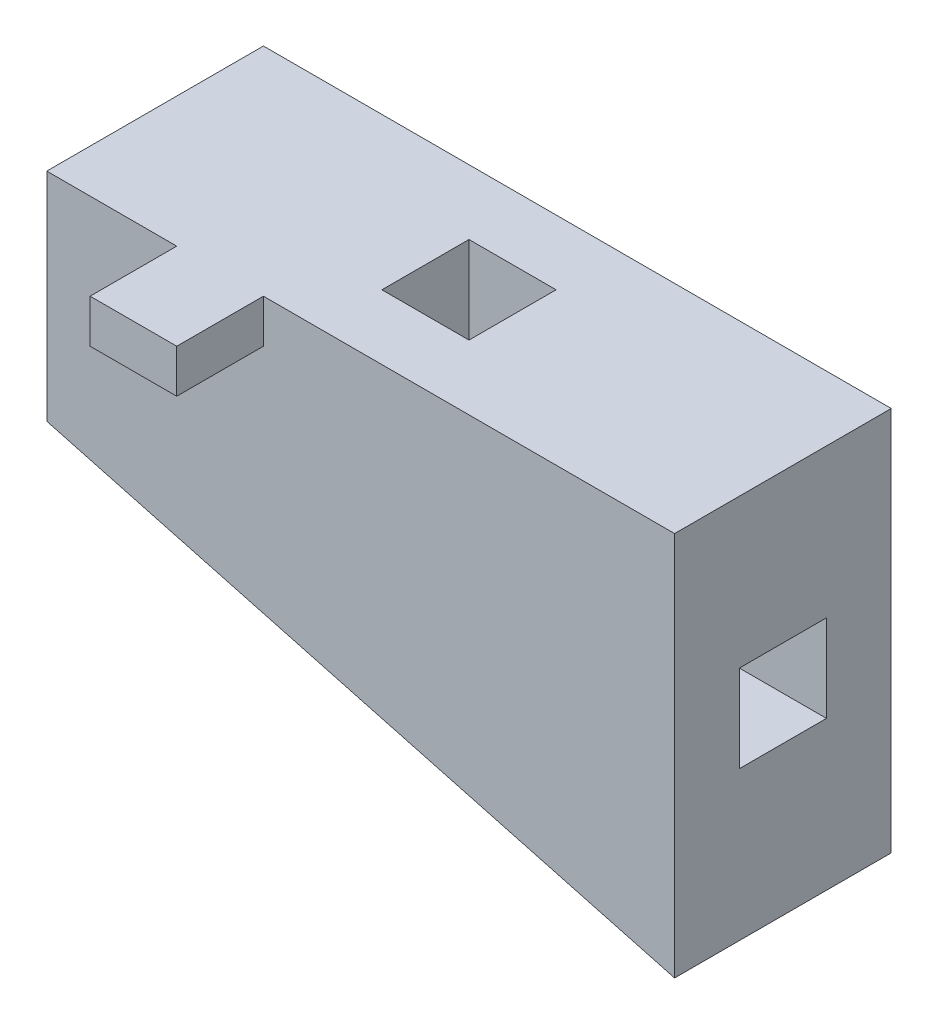
ISO-10303-21;
HEADER;
FILE_DESCRIPTION(('STEP AP214'),'2;1');
FILE_NAME('part.step','',(''),(''),'','','');
FILE_SCHEMA(('AUTOMOTIVE_DESIGN { 1 0 10303 214 1 1 1 1 }'));
ENDSEC;
DATA;
#1=APPLICATION_CONTEXT('core data for automotive mechanical design processes');
#2=APPLICATION_PROTOCOL_DEFINITION('international standard','automotive_design',2000,#1);
#3=PRODUCT_CONTEXT('',#1,'mechanical');
#4=PRODUCT('Part','Part','',(#3));
#5=PRODUCT_RELATED_PRODUCT_CATEGORY('part','',(#4));
#6=PRODUCT_DEFINITION_FORMATION('','',#4);
#7=PRODUCT_DEFINITION_CONTEXT('part definition',#1,'design');
#8=PRODUCT_DEFINITION('design','',#6,#7);
#9=PRODUCT_DEFINITION_SHAPE('','',#8);
#10=(LENGTH_UNIT() NAMED_UNIT(*) SI_UNIT(.MILLI.,.METRE.));
#11=(NAMED_UNIT(*) PLANE_ANGLE_UNIT() SI_UNIT($,.RADIAN.));
#12=(NAMED_UNIT(*) SI_UNIT($,.STERADIAN.) SOLID_ANGLE_UNIT());
#13=UNCERTAINTY_MEASURE_WITH_UNIT(LENGTH_MEASURE(1.E-05),#10,'distance_accuracy_value','');
#14=(GEOMETRIC_REPRESENTATION_CONTEXT(3) GLOBAL_UNCERTAINTY_ASSIGNED_CONTEXT((#13)) GLOBAL_UNIT_ASSIGNED_CONTEXT((#10,
#11,#12)) REPRESENTATION_CONTEXT('',''));
#15=CARTESIAN_POINT('',(0.,0.,0.));
#16=DIRECTION('',(0.,0.,1.));
#17=DIRECTION('',(1.,0.,0.));
#18=AXIS2_PLACEMENT_3D('',#15,#16,#17);
#19=CARTESIAN_POINT('',(45.6887702745492,31.6424845178765,50.));
#20=DIRECTION('',(0.,0.,1.));
#21=DIRECTION('',(1.,0.,0.));
#22=AXIS2_PLACEMENT_3D('',#19,#20,#21);
#23=PLANE('',#22);
#24=DIRECTION('',(1.,0.,0.));
#25=VECTOR('',#24,1.);
#26=CARTESIAN_POINT('',(45.6887702745492,-18.2414554532318,50.));
#27=LINE('',#26,#25);
#28=CARTESIAN_POINT('',(15.6887702745492,-18.2414554532318,50.));
#29=VERTEX_POINT('',#28);
#30=CARTESIAN_POINT('',(110.57764421791,-18.2414554532318,50.));
#31=VERTEX_POINT('',#30);
#32=EDGE_CURVE('E269',#29,#31,#27,.T.);
#33=ORIENTED_EDGE('',*,*,#32,.F.);
#34=DIRECTION('',(0.,-1.,0.));
#35=VECTOR('',#34,1.);
#36=CARTESIAN_POINT('',(15.6887702745492,0.,50.));
#37=LINE('',#36,#35);
#38=CARTESIAN_POINT('',(15.6887702745492,-28.2414554532318,50.));
#39=VERTEX_POINT('',#38);
#40=EDGE_CURVE('E65',#29,#39,#37,.T.);
#41=ORIENTED_EDGE('',*,*,#40,.T.);
#42=DIRECTION('',(1.,0.,0.));
#43=VECTOR('',#42,1.);
#44=CARTESIAN_POINT('',(0.,-28.2414554532318,50.));
#45=LINE('',#44,#43);
#46=CARTESIAN_POINT('',(-4.3112297254508,-28.2414554532318,50.));
#47=VERTEX_POINT('',#46);
#48=EDGE_CURVE('E197',#47,#39,#45,.T.);
#49=ORIENTED_EDGE('',*,*,#48,.F.);
#50=DIRECTION('',(0.,-1.,0.));
#51=VECTOR('',#50,1.);
#52=CARTESIAN_POINT('',(-4.31122972545079,0.,50.));
#53=LINE('',#52,#51);
#54=CARTESIAN_POINT('',(-4.3112297254508,-18.2414554532318,50.));
#55=VERTEX_POINT('',#54);
#56=EDGE_CURVE('E205',#55,#47,#53,.T.);
#57=ORIENTED_EDGE('',*,*,#56,.F.);
#58=CARTESIAN_POINT('',(-34.3112297254508,-18.2414554532318,50.));
#59=VERTEX_POINT('',#58);
#60=EDGE_CURVE('E270',#59,#55,#27,.T.);
#61=ORIENTED_EDGE('',*,*,#60,.F.);
#62=DIRECTION('',(0.,1.,0.));
#63=VECTOR('',#62,1.);
#64=CARTESIAN_POINT('',(-34.3112297254508,-68.2414554532319,50.));
#65=LINE('',#64,#63);
#66=CARTESIAN_POINT('',(-34.3112297254508,-68.2414554532319,50.));
#67=VERTEX_POINT('',#66);
#68=EDGE_CURVE('E245',#67,#59,#65,.T.);
#69=ORIENTED_EDGE('',*,*,#68,.F.);
#70=DIRECTION('',(-0.96592582628907,0.258819045102514,0.));
#71=VECTOR('',#70,1.);
#72=CARTESIAN_POINT('',(-34.3112297254508,-68.2414554532319,50.));
#73=LINE('',#72,#71);
#74=CARTESIAN_POINT('',(110.57764421791,-107.064312218609,50.));
#75=VERTEX_POINT('',#74);
#76=EDGE_CURVE('E260',#75,#67,#73,.T.);
#77=ORIENTED_EDGE('',*,*,#76,.F.);
#78=DIRECTION('',(0.,-1.,0.));
#79=VECTOR('',#78,1.);
#80=CARTESIAN_POINT('',(110.57764421791,31.6424845178765,50.));
#81=LINE('',#80,#79);
#82=EDGE_CURVE('E49',#31,#75,#81,.T.);
#83=ORIENTED_EDGE('',*,*,#82,.F.);
#84=EDGE_LOOP('',(#33,#41,#49,#57,#61,#69,#77,#83));
#85=FACE_BOUND('',#84,.T.);
#86=ADVANCED_FACE('F40',(#85),#23,.T.);
#87=CARTESIAN_POINT('',(110.57764421791,0.,0.));
#88=DIRECTION('',(-1.,0.,0.));
#89=DIRECTION('',(0.,-1.,0.));
#90=AXIS2_PLACEMENT_3D('',#87,#88,#89);
#91=PLANE('',#90);
#92=DIRECTION('',(0.,-1.,0.));
#93=VECTOR('',#92,1.);
#94=CARTESIAN_POINT('',(110.57764421791,-52.6028838359204,35.0500000000001));
#95=LINE('',#94,#93);
#96=CARTESIAN_POINT('',(110.57764421791,-52.6028838359204,35.0500000000001));
#97=VERTEX_POINT('',#96);
#98=CARTESIAN_POINT('',(110.57764421791,-72.7028838359204,35.0500000000001));
#99=VERTEX_POINT('',#98);
#100=EDGE_CURVE('E184',#97,#99,#95,.T.);
#101=ORIENTED_EDGE('',*,*,#100,.F.);
#102=DIRECTION('',(0.,0.,1.));
#103=VECTOR('',#102,1.);
#104=CARTESIAN_POINT('',(110.57764421791,-52.6028838359204,14.95));
#105=LINE('',#104,#103);
#106=CARTESIAN_POINT('',(110.57764421791,-52.6028838359204,14.95));
#107=VERTEX_POINT('',#106);
#108=EDGE_CURVE('E57',#107,#97,#105,.T.);
#109=ORIENTED_EDGE('',*,*,#108,.F.);
#110=DIRECTION('',(0.,1.,0.));
#111=VECTOR('',#110,1.);
#112=CARTESIAN_POINT('',(110.57764421791,-72.7028838359204,14.95));
#113=LINE('',#112,#111);
#114=CARTESIAN_POINT('',(110.57764421791,-72.7028838359204,14.95));
#115=VERTEX_POINT('',#114);
#116=EDGE_CURVE('E175',#115,#107,#113,.T.);
#117=ORIENTED_EDGE('',*,*,#116,.F.);
#118=DIRECTION('',(0.,0.,-1.));
#119=VECTOR('',#118,1.);
#120=CARTESIAN_POINT('',(110.57764421791,-72.7028838359204,35.0500000000001));
#121=LINE('',#120,#119);
#122=EDGE_CURVE('E178',#99,#115,#121,.T.);
#123=ORIENTED_EDGE('',*,*,#122,.F.);
#124=EDGE_LOOP('',(#101,#109,#117,#123));
#125=FACE_BOUND('',#124,.T.);
#126=ORIENTED_EDGE('',*,*,#82,.T.);
#127=DIRECTION('',(0.,0.,-1.));
#128=VECTOR('',#127,1.);
#129=CARTESIAN_POINT('',(110.57764421791,-107.064312218609,50.));
#130=LINE('',#129,#128);
#131=CARTESIAN_POINT('',(110.57764421791,-107.064312218609,0.));
#132=VERTEX_POINT('',#131);
#133=EDGE_CURVE('E11',#75,#132,#130,.T.);
#134=ORIENTED_EDGE('',*,*,#133,.T.);
#135=DIRECTION('',(0.,-1.,0.));
#136=VECTOR('',#135,1.);
#137=CARTESIAN_POINT('',(110.57764421791,31.7585445467682,0.));
#138=LINE('',#137,#136);
#139=CARTESIAN_POINT('',(110.57764421791,-18.2414554532318,0.));
#140=VERTEX_POINT('',#139);
#141=EDGE_CURVE('E273',#140,#132,#138,.T.);
#142=ORIENTED_EDGE('',*,*,#141,.F.);
#143=DIRECTION('',(0.,0.,-1.));
#144=VECTOR('',#143,1.);
#145=CARTESIAN_POINT('',(110.57764421791,-18.2414554532318,0.));
#146=LINE('',#145,#144);
#147=EDGE_CURVE('E44',#31,#140,#146,.T.);
#148=ORIENTED_EDGE('',*,*,#147,.F.);
#149=EDGE_LOOP('',(#126,#134,#142,#148));
#150=FACE_BOUND('',#149,.T.);
#151=ADVANCED_FACE('F42',(#125,#150),#91,.F.);
#152=CARTESIAN_POINT('',(0.,-18.2414554532318,0.));
#153=DIRECTION('',(0.,-1.,0.));
#154=DIRECTION('',(1.,0.,0.));
#155=AXIS2_PLACEMENT_3D('',#152,#153,#154);
#156=PLANE('',#155);
#157=ORIENTED_EDGE('',*,*,#60,.T.);
#158=DIRECTION('',(0.,0.,-1.));
#159=VECTOR('',#158,1.);
#160=CARTESIAN_POINT('',(-4.31122972545079,-18.2414554532318,70.));
#161=LINE('',#160,#159);
#162=CARTESIAN_POINT('',(-4.31122972545079,-18.2414554532318,70.));
#163=VERTEX_POINT('',#162);
#164=EDGE_CURVE('E214',#163,#55,#161,.T.);
#165=ORIENTED_EDGE('',*,*,#164,.F.);
#166=DIRECTION('',(-1.,0.,0.));
#167=VECTOR('',#166,1.);
#168=CARTESIAN_POINT('',(0.,-18.2414554532318,70.));
#169=LINE('',#168,#167);
#170=CARTESIAN_POINT('',(15.6887702745492,-18.2414554532318,70.));
#171=VERTEX_POINT('',#170);
#172=EDGE_CURVE('E196',#171,#163,#169,.T.);
#173=ORIENTED_EDGE('',*,*,#172,.F.);
#174=DIRECTION('',(0.,0.,-1.));
#175=VECTOR('',#174,1.);
#176=CARTESIAN_POINT('',(15.6887702745492,-18.2414554532318,70.));
#177=LINE('',#176,#175);
#178=EDGE_CURVE('E217',#171,#29,#177,.T.);
#179=ORIENTED_EDGE('',*,*,#178,.T.);
#180=ORIENTED_EDGE('',*,*,#32,.T.);
#181=ORIENTED_EDGE('',*,*,#147,.T.);
#182=DIRECTION('',(1.,0.,0.));
#183=VECTOR('',#182,1.);
#184=CARTESIAN_POINT('',(-34.3112297254508,-18.2414554532318,0.));
#185=LINE('',#184,#183);
#186=CARTESIAN_POINT('',(-34.3112297254508,-18.2414554532318,0.));
#187=VERTEX_POINT('',#186);
#188=EDGE_CURVE('E263',#187,#140,#185,.T.);
#189=ORIENTED_EDGE('',*,*,#188,.F.);
#190=DIRECTION('',(0.,0.,-1.));
#191=VECTOR('',#190,1.);
#192=CARTESIAN_POINT('',(-34.3112297254508,-18.2414554532318,750.));
#193=LINE('',#192,#191);
#194=EDGE_CURVE('E267',#59,#187,#193,.T.);
#195=ORIENTED_EDGE('',*,*,#194,.F.);
#196=EDGE_LOOP('',(#157,#165,#173,#179,#180,#181,#189,#195));
#197=FACE_BOUND('',#196,.T.);
#198=DIRECTION('',(0.,0.,-1.));
#199=VECTOR('',#198,1.);
#200=CARTESIAN_POINT('',(28.0832072462295,-18.2414554532318,0.));
#201=LINE('',#200,#199);
#202=CARTESIAN_POINT('',(28.0832072462295,-18.2414554532318,35.05));
#203=VERTEX_POINT('',#202);
#204=CARTESIAN_POINT('',(28.0832072462295,-18.2414554532318,14.95));
#205=VERTEX_POINT('',#204);
#206=EDGE_CURVE('E220',#203,#205,#201,.T.);
#207=ORIENTED_EDGE('',*,*,#206,.T.);
#208=DIRECTION('',(1.,0.,0.));
#209=VECTOR('',#208,1.);
#210=CARTESIAN_POINT('',(0.,-18.2414554532318,14.95));
#211=LINE('',#210,#209);
#212=CARTESIAN_POINT('',(48.1832072462295,-18.2414554532318,14.95));
#213=VERTEX_POINT('',#212);
#214=EDGE_CURVE('E225',#205,#213,#211,.T.);
#215=ORIENTED_EDGE('',*,*,#214,.T.);
#216=DIRECTION('',(0.,0.,1.));
#217=VECTOR('',#216,1.);
#218=CARTESIAN_POINT('',(48.1832072462295,-18.2414554532318,0.));
#219=LINE('',#218,#217);
#220=CARTESIAN_POINT('',(48.1832072462295,-18.2414554532318,35.05));
#221=VERTEX_POINT('',#220);
#222=EDGE_CURVE('E238',#213,#221,#219,.T.);
#223=ORIENTED_EDGE('',*,*,#222,.T.);
#224=DIRECTION('',(1.,0.,0.));
#225=VECTOR('',#224,1.);
#226=CARTESIAN_POINT('',(0.,-18.2414554532318,35.05));
#227=LINE('',#226,#225);
#228=EDGE_CURVE('E235',#203,#221,#227,.T.);
#229=ORIENTED_EDGE('',*,*,#228,.F.);
#230=EDGE_LOOP('',(#207,#215,#223,#229));
#231=FACE_BOUND('',#230,.T.);
#232=ADVANCED_FACE('F282',(#197,#231),#156,.F.);
#233=CARTESIAN_POINT('',(-34.3112297254508,-68.3575154821235,750.));
#234=DIRECTION('',(1.,0.,0.));
#235=DIRECTION('',(0.,1.,0.));
#236=AXIS2_PLACEMENT_3D('',#233,#234,#235);
#237=PLANE('',#236);
#238=ORIENTED_EDGE('',*,*,#68,.T.);
#239=ORIENTED_EDGE('',*,*,#194,.T.);
#240=DIRECTION('',(0.,-1.,0.));
#241=VECTOR('',#240,1.);
#242=CARTESIAN_POINT('',(-34.3112297254508,31.7585445467682,0.));
#243=LINE('',#242,#241);
#244=CARTESIAN_POINT('',(-34.3112297254508,-68.2414554532319,0.));
#245=VERTEX_POINT('',#244);
#246=EDGE_CURVE('E257',#187,#245,#243,.T.);
#247=ORIENTED_EDGE('',*,*,#246,.T.);
#248=DIRECTION('',(0.,0.,1.));
#249=VECTOR('',#248,1.);
#250=CARTESIAN_POINT('',(-34.3112297254508,-68.2414554532319,0.));
#251=LINE('',#250,#249);
#252=EDGE_CURVE('E254',#245,#67,#251,.T.);
#253=ORIENTED_EDGE('',*,*,#252,.T.);
#254=EDGE_LOOP('',(#238,#239,#247,#253));
#255=FACE_BOUND('',#254,.T.);
#256=ADVANCED_FACE('F290',(#255),#237,.F.);
#257=CARTESIAN_POINT('',(-34.3112297254508,-68.2414554532319,50.));
#258=DIRECTION('',(-0.258819045102514,-0.96592582628907,0.));
#259=DIRECTION('',(0.96592582628907,-0.258819045102514,0.));
#260=AXIS2_PLACEMENT_3D('',#257,#258,#259);
#261=PLANE('',#260);
#262=ORIENTED_EDGE('',*,*,#133,.F.);
#263=ORIENTED_EDGE('',*,*,#76,.T.);
#264=ORIENTED_EDGE('',*,*,#252,.F.);
#265=DIRECTION('',(-0.96592582628907,0.258819045102514,0.));
#266=VECTOR('',#265,1.);
#267=CARTESIAN_POINT('',(-34.3112297254508,-68.2414554532319,0.));
#268=LINE('',#267,#266);
#269=EDGE_CURVE('E261',#132,#245,#268,.T.);
#270=ORIENTED_EDGE('',*,*,#269,.F.);
#271=EDGE_LOOP('',(#262,#263,#264,#270));
#272=FACE_BOUND('',#271,.T.);
#273=ADVANCED_FACE('F292',(#272),#261,.T.);
#274=CARTESIAN_POINT('',(-34.3112297254508,31.7585445467682,0.));
#275=DIRECTION('',(0.,0.,1.));
#276=DIRECTION('',(1.,0.,0.));
#277=AXIS2_PLACEMENT_3D('',#274,#275,#276);
#278=PLANE('',#277);
#279=ORIENTED_EDGE('',*,*,#188,.T.);
#280=ORIENTED_EDGE('',*,*,#141,.T.);
#281=ORIENTED_EDGE('',*,*,#269,.T.);
#282=ORIENTED_EDGE('',*,*,#246,.F.);
#283=EDGE_LOOP('',(#279,#280,#281,#282));
#284=FACE_BOUND('',#283,.T.);
#285=ADVANCED_FACE('F287',(#284),#278,.F.);
#286=CARTESIAN_POINT('',(0.,-38.2414554532318,14.95));
#287=DIRECTION('',(0.,0.,1.));
#288=DIRECTION('',(1.,0.,0.));
#289=AXIS2_PLACEMENT_3D('',#286,#287,#288);
#290=PLANE('',#289);
#291=ORIENTED_EDGE('',*,*,#214,.F.);
#292=DIRECTION('',(0.,1.,0.));
#293=VECTOR('',#292,1.);
#294=CARTESIAN_POINT('',(28.0832072462295,-38.2414554532318,14.95));
#295=LINE('',#294,#293);
#296=CARTESIAN_POINT('',(28.0832072462295,-38.2414554532318,14.95));
#297=VERTEX_POINT('',#296);
#298=EDGE_CURVE('E232',#297,#205,#295,.T.);
#299=ORIENTED_EDGE('',*,*,#298,.F.);
#300=DIRECTION('',(1.,0.,0.));
#301=VECTOR('',#300,1.);
#302=CARTESIAN_POINT('',(0.,-38.2414554532318,14.95));
#303=LINE('',#302,#301);
#304=CARTESIAN_POINT('',(48.1832072462295,-38.2414554532318,14.95));
#305=VERTEX_POINT('',#304);
#306=EDGE_CURVE('E230',#297,#305,#303,.T.);
#307=ORIENTED_EDGE('',*,*,#306,.T.);
#308=DIRECTION('',(0.,1.,0.));
#309=VECTOR('',#308,1.);
#310=CARTESIAN_POINT('',(48.1832072462295,-38.2414554532318,14.95));
#311=LINE('',#310,#309);
#312=EDGE_CURVE('E243',#305,#213,#311,.T.);
#313=ORIENTED_EDGE('',*,*,#312,.T.);
#314=EDGE_LOOP('',(#291,#299,#307,#313));
#315=FACE_BOUND('',#314,.T.);
#316=ADVANCED_FACE('F328',(#315),#290,.T.);
#317=CARTESIAN_POINT('',(48.1832072462295,-38.2414554532318,0.));
#318=DIRECTION('',(-1.,0.,0.));
#319=DIRECTION('',(0.,0.,1.));
#320=AXIS2_PLACEMENT_3D('',#317,#318,#319);
#321=PLANE('',#320);
#322=ORIENTED_EDGE('',*,*,#222,.F.);
#323=ORIENTED_EDGE('',*,*,#312,.F.);
#324=DIRECTION('',(0.,0.,1.));
#325=VECTOR('',#324,1.);
#326=CARTESIAN_POINT('',(48.1832072462295,-38.2414554532318,0.));
#327=LINE('',#326,#325);
#328=CARTESIAN_POINT('',(48.1832072462295,-38.2414554532318,35.05));
#329=VERTEX_POINT('',#328);
#330=EDGE_CURVE('E228',#305,#329,#327,.T.);
#331=ORIENTED_EDGE('',*,*,#330,.T.);
#332=DIRECTION('',(0.,1.,0.));
#333=VECTOR('',#332,1.);
#334=CARTESIAN_POINT('',(48.1832072462295,-38.2414554532318,35.05));
#335=LINE('',#334,#333);
#336=EDGE_CURVE('E246',#329,#221,#335,.T.);
#337=ORIENTED_EDGE('',*,*,#336,.T.);
#338=EDGE_LOOP('',(#322,#323,#331,#337));
#339=FACE_BOUND('',#338,.T.);
#340=ADVANCED_FACE('F337',(#339),#321,.T.);
#341=CARTESIAN_POINT('',(0.,-38.2414554532318,35.05));
#342=DIRECTION('',(0.,0.,1.));
#343=DIRECTION('',(1.,0.,0.));
#344=AXIS2_PLACEMENT_3D('',#341,#342,#343);
#345=PLANE('',#344);
#346=ORIENTED_EDGE('',*,*,#228,.T.);
#347=ORIENTED_EDGE('',*,*,#336,.F.);
#348=DIRECTION('',(1.,0.,0.));
#349=VECTOR('',#348,1.);
#350=CARTESIAN_POINT('',(0.,-38.2414554532318,35.05));
#351=LINE('',#350,#349);
#352=CARTESIAN_POINT('',(28.0832072462295,-38.2414554532318,35.05));
#353=VERTEX_POINT('',#352);
#354=EDGE_CURVE('E224',#353,#329,#351,.T.);
#355=ORIENTED_EDGE('',*,*,#354,.F.);
#356=DIRECTION('',(0.,1.,0.));
#357=VECTOR('',#356,1.);
#358=CARTESIAN_POINT('',(28.0832072462295,-38.2414554532318,35.05));
#359=LINE('',#358,#357);
#360=EDGE_CURVE('E248',#353,#203,#359,.T.);
#361=ORIENTED_EDGE('',*,*,#360,.T.);
#362=EDGE_LOOP('',(#346,#347,#355,#361));
#363=FACE_BOUND('',#362,.T.);
#364=ADVANCED_FACE('F345',(#363),#345,.F.);
#365=CARTESIAN_POINT('',(28.0832072462295,-38.2414554532318,0.));
#366=DIRECTION('',(1.,0.,0.));
#367=DIRECTION('',(0.,1.,0.));
#368=AXIS2_PLACEMENT_3D('',#365,#366,#367);
#369=PLANE('',#368);
#370=ORIENTED_EDGE('',*,*,#206,.F.);
#371=ORIENTED_EDGE('',*,*,#360,.F.);
#372=DIRECTION('',(0.,0.,-1.));
#373=VECTOR('',#372,1.);
#374=CARTESIAN_POINT('',(28.0832072462295,-38.2414554532318,0.));
#375=LINE('',#374,#373);
#376=EDGE_CURVE('E221',#353,#297,#375,.T.);
#377=ORIENTED_EDGE('',*,*,#376,.T.);
#378=ORIENTED_EDGE('',*,*,#298,.T.);
#379=EDGE_LOOP('',(#370,#371,#377,#378));
#380=FACE_BOUND('',#379,.T.);
#381=ADVANCED_FACE('F341',(#380),#369,.T.);
#382=CARTESIAN_POINT('',(0.,-38.2414554532318,0.));
#383=DIRECTION('',(0.,1.,0.));
#384=DIRECTION('',(-1.,0.,0.));
#385=AXIS2_PLACEMENT_3D('',#382,#383,#384);
#386=PLANE('',#385);
#387=ORIENTED_EDGE('',*,*,#306,.F.);
#388=ORIENTED_EDGE('',*,*,#376,.F.);
#389=ORIENTED_EDGE('',*,*,#354,.T.);
#390=ORIENTED_EDGE('',*,*,#330,.F.);
#391=EDGE_LOOP('',(#387,#388,#389,#390));
#392=FACE_BOUND('',#391,.T.);
#393=ADVANCED_FACE('F344',(#392),#386,.T.);
#394=CARTESIAN_POINT('',(15.6887702745492,0.,70.));
#395=DIRECTION('',(1.,0.,0.));
#396=DIRECTION('',(0.,1.,0.));
#397=AXIS2_PLACEMENT_3D('',#394,#395,#396);
#398=PLANE('',#397);
#399=ORIENTED_EDGE('',*,*,#40,.F.);
#400=ORIENTED_EDGE('',*,*,#178,.F.);
#401=DIRECTION('',(0.,-1.,0.));
#402=VECTOR('',#401,1.);
#403=CARTESIAN_POINT('',(15.6887702745492,0.,70.));
#404=LINE('',#403,#402);
#405=CARTESIAN_POINT('',(15.6887702745492,-28.2414554532318,70.));
#406=VERTEX_POINT('',#405);
#407=EDGE_CURVE('E193',#171,#406,#404,.T.);
#408=ORIENTED_EDGE('',*,*,#407,.T.);
#409=DIRECTION('',(0.,0.,-1.));
#410=VECTOR('',#409,1.);
#411=CARTESIAN_POINT('',(15.6887702745492,-28.2414554532318,70.));
#412=LINE('',#411,#410);
#413=EDGE_CURVE('E203',#406,#39,#412,.T.);
#414=ORIENTED_EDGE('',*,*,#413,.T.);
#415=EDGE_LOOP('',(#399,#400,#408,#414));
#416=FACE_BOUND('',#415,.T.);
#417=ADVANCED_FACE('F307',(#416),#398,.T.);
#418=CARTESIAN_POINT('',(-4.31122972545079,0.,70.));
#419=DIRECTION('',(1.,0.,0.));
#420=DIRECTION('',(0.,1.,0.));
#421=AXIS2_PLACEMENT_3D('',#418,#419,#420);
#422=PLANE('',#421);
#423=ORIENTED_EDGE('',*,*,#56,.T.);
#424=DIRECTION('',(0.,0.,-1.));
#425=VECTOR('',#424,1.);
#426=CARTESIAN_POINT('',(-4.3112297254508,-28.2414554532318,70.));
#427=LINE('',#426,#425);
#428=CARTESIAN_POINT('',(-4.3112297254508,-28.2414554532318,70.));
#429=VERTEX_POINT('',#428);
#430=EDGE_CURVE('E211',#429,#47,#427,.T.);
#431=ORIENTED_EDGE('',*,*,#430,.F.);
#432=DIRECTION('',(0.,-1.,0.));
#433=VECTOR('',#432,1.);
#434=CARTESIAN_POINT('',(-4.31122972545079,0.,70.));
#435=LINE('',#434,#433);
#436=EDGE_CURVE('E199',#163,#429,#435,.T.);
#437=ORIENTED_EDGE('',*,*,#436,.F.);
#438=ORIENTED_EDGE('',*,*,#164,.T.);
#439=EDGE_LOOP('',(#423,#431,#437,#438));
#440=FACE_BOUND('',#439,.T.);
#441=ADVANCED_FACE('F299',(#440),#422,.F.);
#442=CARTESIAN_POINT('',(0.,-28.2414554532318,70.));
#443=DIRECTION('',(0.,1.,0.));
#444=DIRECTION('',(-1.,0.,0.));
#445=AXIS2_PLACEMENT_3D('',#442,#443,#444);
#446=PLANE('',#445);
#447=ORIENTED_EDGE('',*,*,#48,.T.);
#448=ORIENTED_EDGE('',*,*,#413,.F.);
#449=DIRECTION('',(1.,0.,0.));
#450=VECTOR('',#449,1.);
#451=CARTESIAN_POINT('',(0.,-28.2414554532318,70.));
#452=LINE('',#451,#450);
#453=EDGE_CURVE('E201',#429,#406,#452,.T.);
#454=ORIENTED_EDGE('',*,*,#453,.F.);
#455=ORIENTED_EDGE('',*,*,#430,.T.);
#456=EDGE_LOOP('',(#447,#448,#454,#455));
#457=FACE_BOUND('',#456,.T.);
#458=ADVANCED_FACE('F309',(#457),#446,.F.);
#459=CARTESIAN_POINT('',(0.,0.,70.));
#460=DIRECTION('',(0.,0.,1.));
#461=DIRECTION('',(1.,0.,0.));
#462=AXIS2_PLACEMENT_3D('',#459,#460,#461);
#463=PLANE('',#462);
#464=ORIENTED_EDGE('',*,*,#407,.F.);
#465=ORIENTED_EDGE('',*,*,#172,.T.);
#466=ORIENTED_EDGE('',*,*,#436,.T.);
#467=ORIENTED_EDGE('',*,*,#453,.T.);
#468=EDGE_LOOP('',(#464,#465,#466,#467));
#469=FACE_BOUND('',#468,.T.);
#470=ADVANCED_FACE('F304',(#469),#463,.T.);
#471=CARTESIAN_POINT('',(90.5776442179097,-52.6028838359204,14.95));
#472=DIRECTION('',(0.,1.,0.));
#473=DIRECTION('',(0.,0.,1.));
#474=AXIS2_PLACEMENT_3D('',#471,#472,#473);
#475=PLANE('',#474);
#476=ORIENTED_EDGE('',*,*,#108,.T.);
#477=DIRECTION('',(1.,0.,0.));
#478=VECTOR('',#477,1.);
#479=CARTESIAN_POINT('',(90.5776442179097,-52.6028838359204,35.0500000000001));
#480=LINE('',#479,#478);
#481=CARTESIAN_POINT('',(90.5776442179097,-52.6028838359204,35.0500000000001));
#482=VERTEX_POINT('',#481);
#483=EDGE_CURVE('E153',#482,#97,#480,.T.);
#484=ORIENTED_EDGE('',*,*,#483,.F.);
#485=DIRECTION('',(0.,0.,1.));
#486=VECTOR('',#485,1.);
#487=CARTESIAN_POINT('',(90.5776442179097,-52.6028838359204,14.95));
#488=LINE('',#487,#486);
#489=CARTESIAN_POINT('',(90.5776442179097,-52.6028838359204,14.95));
#490=VERTEX_POINT('',#489);
#491=EDGE_CURVE('E157',#490,#482,#488,.T.);
#492=ORIENTED_EDGE('',*,*,#491,.F.);
#493=DIRECTION('',(1.,0.,0.));
#494=VECTOR('',#493,1.);
#495=CARTESIAN_POINT('',(90.5776442179097,-52.6028838359204,14.95));
#496=LINE('',#495,#494);
#497=EDGE_CURVE('E188',#490,#107,#496,.T.);
#498=ORIENTED_EDGE('',*,*,#497,.T.);
#499=EDGE_LOOP('',(#476,#484,#492,#498));
#500=FACE_BOUND('',#499,.T.);
#501=ADVANCED_FACE('F155',(#500),#475,.F.);
#502=CARTESIAN_POINT('',(90.5776442179097,-72.7028838359204,14.95));
#503=DIRECTION('',(0.,0.,-1.));
#504=DIRECTION('',(-1.,0.,0.));
#505=AXIS2_PLACEMENT_3D('',#502,#503,#504);
#506=PLANE('',#505);
#507=ORIENTED_EDGE('',*,*,#116,.T.);
#508=ORIENTED_EDGE('',*,*,#497,.F.);
#509=DIRECTION('',(0.,1.,0.));
#510=VECTOR('',#509,1.);
#511=CARTESIAN_POINT('',(90.5776442179097,-72.7028838359204,14.95));
#512=LINE('',#511,#510);
#513=CARTESIAN_POINT('',(90.5776442179097,-72.7028838359204,14.95));
#514=VERTEX_POINT('',#513);
#515=EDGE_CURVE('E163',#514,#490,#512,.T.);
#516=ORIENTED_EDGE('',*,*,#515,.F.);
#517=DIRECTION('',(1.,0.,0.));
#518=VECTOR('',#517,1.);
#519=CARTESIAN_POINT('',(90.5776442179097,-72.7028838359204,14.95));
#520=LINE('',#519,#518);
#521=EDGE_CURVE('E190',#514,#115,#520,.T.);
#522=ORIENTED_EDGE('',*,*,#521,.T.);
#523=EDGE_LOOP('',(#507,#508,#516,#522));
#524=FACE_BOUND('',#523,.T.);
#525=ADVANCED_FACE('F418',(#524),#506,.F.);
#526=CARTESIAN_POINT('',(90.5776442179097,-72.7028838359204,35.0500000000001));
#527=DIRECTION('',(0.,-1.,0.));
#528=DIRECTION('',(1.,0.,0.));
#529=AXIS2_PLACEMENT_3D('',#526,#527,#528);
#530=PLANE('',#529);
#531=ORIENTED_EDGE('',*,*,#122,.T.);
#532=ORIENTED_EDGE('',*,*,#521,.F.);
#533=DIRECTION('',(0.,0.,-1.));
#534=VECTOR('',#533,1.);
#535=CARTESIAN_POINT('',(90.5776442179097,-72.7028838359204,35.0500000000001));
#536=LINE('',#535,#534);
#537=CARTESIAN_POINT('',(90.5776442179097,-72.7028838359204,35.0500000000001));
#538=VERTEX_POINT('',#537);
#539=EDGE_CURVE('E171',#538,#514,#536,.T.);
#540=ORIENTED_EDGE('',*,*,#539,.F.);
#541=DIRECTION('',(1.,0.,0.));
#542=VECTOR('',#541,1.);
#543=CARTESIAN_POINT('',(90.5776442179097,-72.7028838359204,35.0500000000001));
#544=LINE('',#543,#542);
#545=EDGE_CURVE('E162',#538,#99,#544,.T.);
#546=ORIENTED_EDGE('',*,*,#545,.T.);
#547=EDGE_LOOP('',(#531,#532,#540,#546));
#548=FACE_BOUND('',#547,.T.);
#549=ADVANCED_FACE('F427',(#548),#530,.F.);
#550=CARTESIAN_POINT('',(90.5776442179097,-52.6028838359204,35.0500000000001));
#551=DIRECTION('',(0.,0.,1.));
#552=DIRECTION('',(1.,0.,0.));
#553=AXIS2_PLACEMENT_3D('',#550,#551,#552);
#554=PLANE('',#553);
#555=ORIENTED_EDGE('',*,*,#100,.T.);
#556=ORIENTED_EDGE('',*,*,#545,.F.);
#557=DIRECTION('',(0.,-1.,0.));
#558=VECTOR('',#557,1.);
#559=CARTESIAN_POINT('',(90.5776442179097,-52.6028838359204,35.0500000000001));
#560=LINE('',#559,#558);
#561=EDGE_CURVE('E166',#482,#538,#560,.T.);
#562=ORIENTED_EDGE('',*,*,#561,.F.);
#563=ORIENTED_EDGE('',*,*,#483,.T.);
#564=EDGE_LOOP('',(#555,#556,#562,#563));
#565=FACE_BOUND('',#564,.T.);
#566=ADVANCED_FACE('F167',(#565),#554,.F.);
#567=CARTESIAN_POINT('',(90.5776442179097,0.,0.));
#568=DIRECTION('',(1.,0.,0.));
#569=DIRECTION('',(0.,1.,0.));
#570=AXIS2_PLACEMENT_3D('',#567,#568,#569);
#571=PLANE('',#570);
#572=ORIENTED_EDGE('',*,*,#491,.T.);
#573=ORIENTED_EDGE('',*,*,#561,.T.);
#574=ORIENTED_EDGE('',*,*,#539,.T.);
#575=ORIENTED_EDGE('',*,*,#515,.T.);
#576=EDGE_LOOP('',(#572,#573,#574,#575));
#577=FACE_BOUND('',#576,.T.);
#578=ADVANCED_FACE('F173',(#577),#571,.T.);
#579=CLOSED_SHELL('',(#86,#151,#232,#256,#273,#285,#316,#340,#364,#381,#393,#417,#441,#458,#470,
#501,#525,#549,#566,#578));
#580=MANIFOLD_SOLID_BREP('B2',#579);
#581=ADVANCED_BREP_SHAPE_REPRESENTATION('',(#18,#580),#14);
#582=SHAPE_DEFINITION_REPRESENTATION(#9,#581);
ENDSEC;
END-ISO-10303-21;
